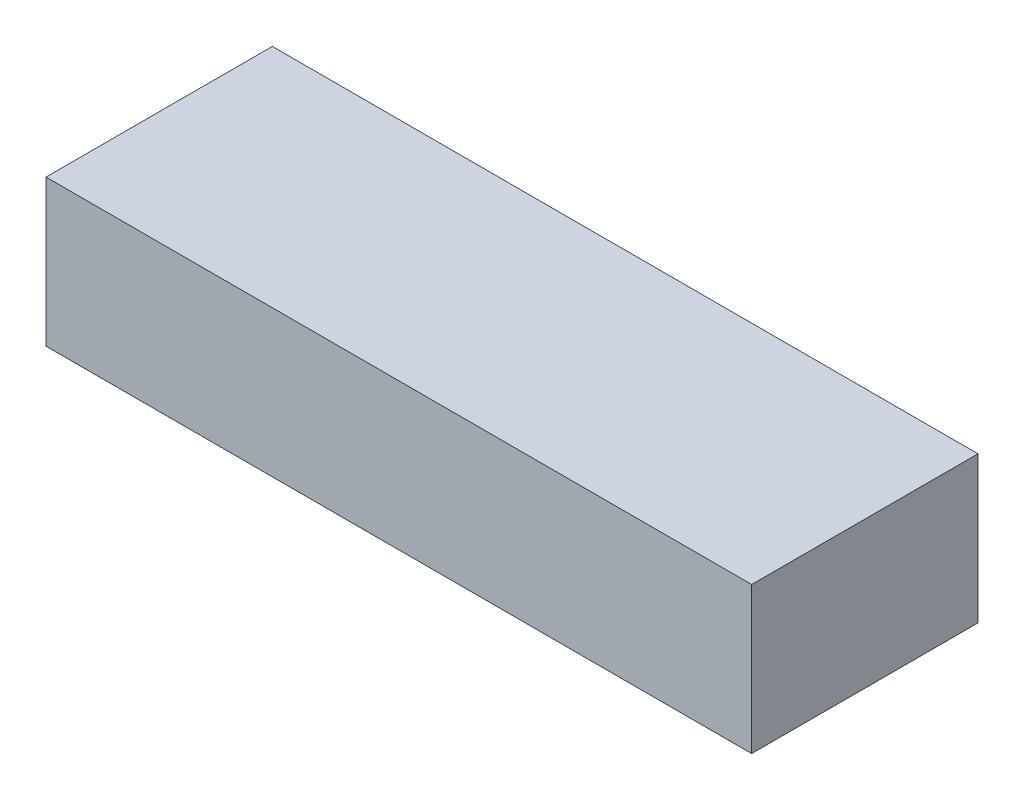
ISO-10303-21;
HEADER;
FILE_DESCRIPTION(('STEP AP214'),'2;1');
FILE_NAME('part.step','',(''),(''),'','','');
FILE_SCHEMA(('AUTOMOTIVE_DESIGN { 1 0 10303 214 1 1 1 1 }'));
ENDSEC;
DATA;
#1=APPLICATION_CONTEXT('core data for automotive mechanical design processes');
#2=APPLICATION_PROTOCOL_DEFINITION('international standard','automotive_design',2000,#1);
#3=PRODUCT_CONTEXT('',#1,'mechanical');
#4=PRODUCT('Part','Part','',(#3));
#5=PRODUCT_RELATED_PRODUCT_CATEGORY('part','',(#4));
#6=PRODUCT_DEFINITION_FORMATION('','',#4);
#7=PRODUCT_DEFINITION_CONTEXT('part definition',#1,'design');
#8=PRODUCT_DEFINITION('design','',#6,#7);
#9=PRODUCT_DEFINITION_SHAPE('','',#8);
#10=(LENGTH_UNIT() NAMED_UNIT(*) SI_UNIT(.MILLI.,.METRE.));
#11=(NAMED_UNIT(*) PLANE_ANGLE_UNIT() SI_UNIT($,.RADIAN.));
#12=(NAMED_UNIT(*) SI_UNIT($,.STERADIAN.) SOLID_ANGLE_UNIT());
#13=UNCERTAINTY_MEASURE_WITH_UNIT(LENGTH_MEASURE(1.E-05),#10,'distance_accuracy_value','');
#14=(GEOMETRIC_REPRESENTATION_CONTEXT(3) GLOBAL_UNCERTAINTY_ASSIGNED_CONTEXT((#13)) GLOBAL_UNIT_ASSIGNED_CONTEXT((#10,
#11,#12)) REPRESENTATION_CONTEXT('',''));
#15=CARTESIAN_POINT('',(0.,0.,0.));
#16=DIRECTION('',(0.,0.,1.));
#17=DIRECTION('',(1.,0.,0.));
#18=AXIS2_PLACEMENT_3D('',#15,#16,#17);
#19=CARTESIAN_POINT('',(53.,22.,17.));
#20=DIRECTION('',(-1.,0.,0.));
#21=DIRECTION('',(0.,0.,1.));
#22=AXIS2_PLACEMENT_3D('',#19,#20,#21);
#23=PLANE('',#22);
#24=DIRECTION('',(0.,0.,-1.));
#25=VECTOR('',#24,1.);
#26=CARTESIAN_POINT('',(53.,0.,17.));
#27=LINE('',#26,#25);
#28=CARTESIAN_POINT('',(53.,0.,17.));
#29=VERTEX_POINT('',#28);
#30=CARTESIAN_POINT('',(53.,0.,-17.));
#31=VERTEX_POINT('',#30);
#32=EDGE_CURVE('E95',#29,#31,#27,.T.);
#33=ORIENTED_EDGE('',*,*,#32,.T.);
#34=DIRECTION('',(0.,-1.,0.));
#35=VECTOR('',#34,1.);
#36=CARTESIAN_POINT('',(53.,22.,-17.));
#37=LINE('',#36,#35);
#38=CARTESIAN_POINT('',(53.,22.,-17.));
#39=VERTEX_POINT('',#38);
#40=EDGE_CURVE('E11',#39,#31,#37,.T.);
#41=ORIENTED_EDGE('',*,*,#40,.F.);
#42=DIRECTION('',(0.,0.,-1.));
#43=VECTOR('',#42,1.);
#44=CARTESIAN_POINT('',(53.,22.,17.));
#45=LINE('',#44,#43);
#46=CARTESIAN_POINT('',(53.,22.,17.));
#47=VERTEX_POINT('',#46);
#48=EDGE_CURVE('E83',#47,#39,#45,.T.);
#49=ORIENTED_EDGE('',*,*,#48,.F.);
#50=DIRECTION('',(0.,-1.,0.));
#51=VECTOR('',#50,1.);
#52=CARTESIAN_POINT('',(53.,22.,17.));
#53=LINE('',#52,#51);
#54=EDGE_CURVE('E91',#47,#29,#53,.T.);
#55=ORIENTED_EDGE('',*,*,#54,.T.);
#56=EDGE_LOOP('',(#33,#41,#49,#55));
#57=FACE_BOUND('',#56,.T.);
#58=ADVANCED_FACE('F32',(#57),#23,.F.);
#59=CARTESIAN_POINT('',(-53.,22.,-17.));
#60=DIRECTION('',(0.,0.,1.));
#61=DIRECTION('',(1.,0.,0.));
#62=AXIS2_PLACEMENT_3D('',#59,#60,#61);
#63=PLANE('',#62);
#64=DIRECTION('',(-1.,0.,0.));
#65=VECTOR('',#64,1.);
#66=CARTESIAN_POINT('',(-53.,0.,-17.));
#67=LINE('',#66,#65);
#68=CARTESIAN_POINT('',(-53.,0.,-17.));
#69=VERTEX_POINT('',#68);
#70=EDGE_CURVE('E87',#31,#69,#67,.T.);
#71=ORIENTED_EDGE('',*,*,#70,.T.);
#72=DIRECTION('',(0.,-1.,0.));
#73=VECTOR('',#72,1.);
#74=CARTESIAN_POINT('',(-53.,22.,-17.));
#75=LINE('',#74,#73);
#76=CARTESIAN_POINT('',(-53.,22.,-17.));
#77=VERTEX_POINT('',#76);
#78=EDGE_CURVE('E40',#77,#69,#75,.T.);
#79=ORIENTED_EDGE('',*,*,#78,.F.);
#80=DIRECTION('',(-1.,0.,0.));
#81=VECTOR('',#80,1.);
#82=CARTESIAN_POINT('',(-53.,22.,-17.));
#83=LINE('',#82,#81);
#84=EDGE_CURVE('E78',#39,#77,#83,.T.);
#85=ORIENTED_EDGE('',*,*,#84,.F.);
#86=ORIENTED_EDGE('',*,*,#40,.T.);
#87=EDGE_LOOP('',(#71,#79,#85,#86));
#88=FACE_BOUND('',#87,.T.);
#89=ADVANCED_FACE('F86',(#88),#63,.F.);
#90=CARTESIAN_POINT('',(-53.,22.,17.));
#91=DIRECTION('',(1.,0.,0.));
#92=DIRECTION('',(0.,0.,-1.));
#93=AXIS2_PLACEMENT_3D('',#90,#91,#92);
#94=PLANE('',#93);
#95=DIRECTION('',(0.,0.,1.));
#96=VECTOR('',#95,1.);
#97=CARTESIAN_POINT('',(-53.,0.,17.));
#98=LINE('',#97,#96);
#99=CARTESIAN_POINT('',(-53.,0.,17.));
#100=VERTEX_POINT('',#99);
#101=EDGE_CURVE('E65',#69,#100,#98,.T.);
#102=ORIENTED_EDGE('',*,*,#101,.T.);
#103=DIRECTION('',(0.,-1.,0.));
#104=VECTOR('',#103,1.);
#105=CARTESIAN_POINT('',(-53.,22.,17.));
#106=LINE('',#105,#104);
#107=CARTESIAN_POINT('',(-53.,22.,17.));
#108=VERTEX_POINT('',#107);
#109=EDGE_CURVE('E88',#108,#100,#106,.T.);
#110=ORIENTED_EDGE('',*,*,#109,.F.);
#111=DIRECTION('',(0.,0.,1.));
#112=VECTOR('',#111,1.);
#113=CARTESIAN_POINT('',(-53.,22.,17.));
#114=LINE('',#113,#112);
#115=EDGE_CURVE('E81',#77,#108,#114,.T.);
#116=ORIENTED_EDGE('',*,*,#115,.F.);
#117=ORIENTED_EDGE('',*,*,#78,.T.);
#118=EDGE_LOOP('',(#102,#110,#116,#117));
#119=FACE_BOUND('',#118,.T.);
#120=ADVANCED_FACE('F89',(#119),#94,.F.);
#121=CARTESIAN_POINT('',(-53.,22.,17.));
#122=DIRECTION('',(0.,0.,-1.));
#123=DIRECTION('',(-1.,0.,0.));
#124=AXIS2_PLACEMENT_3D('',#121,#122,#123);
#125=PLANE('',#124);
#126=DIRECTION('',(1.,0.,0.));
#127=VECTOR('',#126,1.);
#128=CARTESIAN_POINT('',(-53.,0.,17.));
#129=LINE('',#128,#127);
#130=EDGE_CURVE('E71',#100,#29,#129,.T.);
#131=ORIENTED_EDGE('',*,*,#130,.T.);
#132=ORIENTED_EDGE('',*,*,#54,.F.);
#133=DIRECTION('',(1.,0.,0.));
#134=VECTOR('',#133,1.);
#135=CARTESIAN_POINT('',(-53.,22.,17.));
#136=LINE('',#135,#134);
#137=EDGE_CURVE('E48',#108,#47,#136,.T.);
#138=ORIENTED_EDGE('',*,*,#137,.F.);
#139=ORIENTED_EDGE('',*,*,#109,.T.);
#140=EDGE_LOOP('',(#131,#132,#138,#139));
#141=FACE_BOUND('',#140,.T.);
#142=ADVANCED_FACE('F102',(#141),#125,.F.);
#143=CARTESIAN_POINT('',(0.,22.,0.));
#144=DIRECTION('',(0.,-1.,0.));
#145=DIRECTION('',(0.,0.,-1.));
#146=AXIS2_PLACEMENT_3D('',#143,#144,#145);
#147=PLANE('',#146);
#148=ORIENTED_EDGE('',*,*,#48,.T.);
#149=ORIENTED_EDGE('',*,*,#84,.T.);
#150=ORIENTED_EDGE('',*,*,#115,.T.);
#151=ORIENTED_EDGE('',*,*,#137,.T.);
#152=EDGE_LOOP('',(#148,#149,#150,#151));
#153=FACE_BOUND('',#152,.T.);
#154=ADVANCED_FACE('F79',(#153),#147,.F.);
#155=CARTESIAN_POINT('',(0.,0.,0.));
#156=DIRECTION('',(0.,-1.,0.));
#157=DIRECTION('',(0.,0.,-1.));
#158=AXIS2_PLACEMENT_3D('',#155,#156,#157);
#159=PLANE('',#158);
#160=ORIENTED_EDGE('',*,*,#32,.F.);
#161=ORIENTED_EDGE('',*,*,#130,.F.);
#162=ORIENTED_EDGE('',*,*,#101,.F.);
#163=ORIENTED_EDGE('',*,*,#70,.F.);
#164=EDGE_LOOP('',(#160,#161,#162,#163));
#165=FACE_BOUND('',#164,.T.);
#166=ADVANCED_FACE('F105',(#165),#159,.T.);
#167=CLOSED_SHELL('',(#58,#89,#120,#142,#154,#166));
#168=MANIFOLD_SOLID_BREP('B2',#167);
#169=ADVANCED_BREP_SHAPE_REPRESENTATION('',(#18,#168),#14);
#170=SHAPE_DEFINITION_REPRESENTATION(#9,#169);
ENDSEC;
END-ISO-10303-21;
